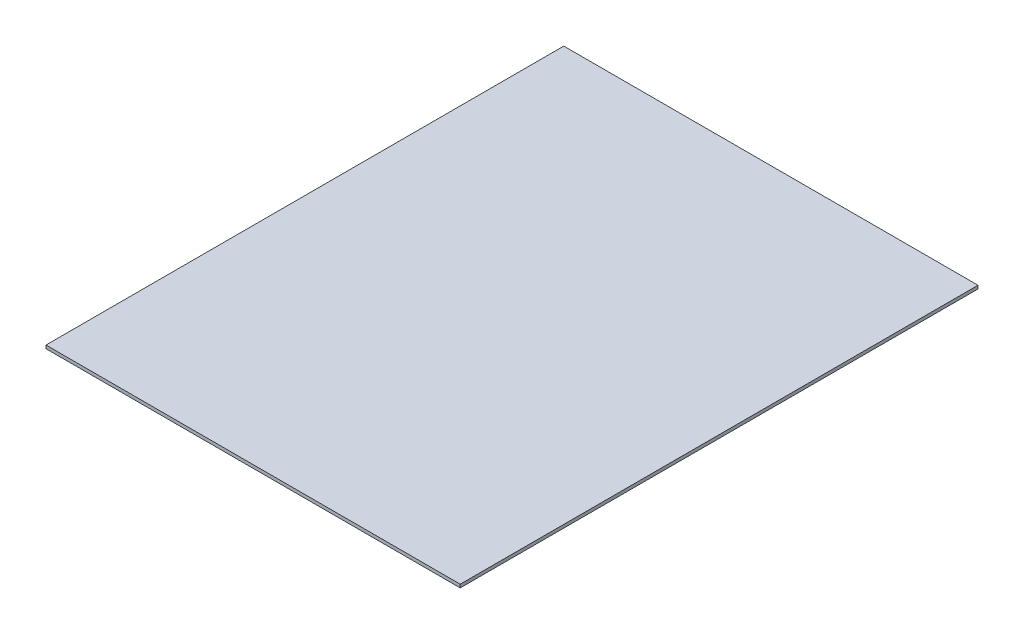
ISO-10303-21;
HEADER;
FILE_DESCRIPTION(('STEP AP214'),'2;1');
FILE_NAME('part.step','',(''),(''),'','','');
FILE_SCHEMA(('AUTOMOTIVE_DESIGN { 1 0 10303 214 1 1 1 1 }'));
ENDSEC;
DATA;
#1=APPLICATION_CONTEXT('core data for automotive mechanical design processes');
#2=APPLICATION_PROTOCOL_DEFINITION('international standard','automotive_design',2000,#1);
#3=PRODUCT_CONTEXT('',#1,'mechanical');
#4=PRODUCT('Part','Part','',(#3));
#5=PRODUCT_RELATED_PRODUCT_CATEGORY('part','',(#4));
#6=PRODUCT_DEFINITION_FORMATION('','',#4);
#7=PRODUCT_DEFINITION_CONTEXT('part definition',#1,'design');
#8=PRODUCT_DEFINITION('design','',#6,#7);
#9=PRODUCT_DEFINITION_SHAPE('','',#8);
#10=(LENGTH_UNIT() NAMED_UNIT(*) SI_UNIT(.MILLI.,.METRE.));
#11=(NAMED_UNIT(*) PLANE_ANGLE_UNIT() SI_UNIT($,.RADIAN.));
#12=(NAMED_UNIT(*) SI_UNIT($,.STERADIAN.) SOLID_ANGLE_UNIT());
#13=UNCERTAINTY_MEASURE_WITH_UNIT(LENGTH_MEASURE(1.E-05),#10,'distance_accuracy_value','');
#14=(GEOMETRIC_REPRESENTATION_CONTEXT(3) GLOBAL_UNCERTAINTY_ASSIGNED_CONTEXT((#13)) GLOBAL_UNIT_ASSIGNED_CONTEXT((#10,
#11,#12)) REPRESENTATION_CONTEXT('',''));
#15=CARTESIAN_POINT('',(0.,0.,0.));
#16=DIRECTION('',(0.,0.,1.));
#17=DIRECTION('',(1.,0.,0.));
#18=AXIS2_PLACEMENT_3D('',#15,#16,#17);
#19=CARTESIAN_POINT('',(0.,3.175,0.));
#20=DIRECTION('',(1.,0.,0.));
#21=DIRECTION('',(0.,0.,-1.));
#22=AXIS2_PLACEMENT_3D('',#19,#20,#21);
#23=PLANE('',#22);
#24=DIRECTION('',(0.,0.,1.));
#25=VECTOR('',#24,1.);
#26=CARTESIAN_POINT('',(0.,0.,0.));
#27=LINE('',#26,#25);
#28=CARTESIAN_POINT('',(0.,0.,-508.));
#29=VERTEX_POINT('',#28);
#30=CARTESIAN_POINT('',(0.,0.,0.));
#31=VERTEX_POINT('',#30);
#32=EDGE_CURVE('E96',#29,#31,#27,.T.);
#33=ORIENTED_EDGE('',*,*,#32,.T.);
#34=DIRECTION('',(0.,-1.,0.));
#35=VECTOR('',#34,1.);
#36=CARTESIAN_POINT('',(0.,3.175,0.));
#37=LINE('',#36,#35);
#38=CARTESIAN_POINT('',(0.,3.175,0.));
#39=VERTEX_POINT('',#38);
#40=EDGE_CURVE('E11',#39,#31,#37,.T.);
#41=ORIENTED_EDGE('',*,*,#40,.F.);
#42=DIRECTION('',(0.,0.,1.));
#43=VECTOR('',#42,1.);
#44=CARTESIAN_POINT('',(0.,3.175,0.));
#45=LINE('',#44,#43);
#46=CARTESIAN_POINT('',(0.,3.175,-508.));
#47=VERTEX_POINT('',#46);
#48=EDGE_CURVE('E84',#47,#39,#45,.T.);
#49=ORIENTED_EDGE('',*,*,#48,.F.);
#50=DIRECTION('',(0.,-1.,0.));
#51=VECTOR('',#50,1.);
#52=CARTESIAN_POINT('',(0.,3.175,-508.));
#53=LINE('',#52,#51);
#54=EDGE_CURVE('E92',#47,#29,#53,.T.);
#55=ORIENTED_EDGE('',*,*,#54,.T.);
#56=EDGE_LOOP('',(#33,#41,#49,#55));
#57=FACE_BOUND('',#56,.T.);
#58=ADVANCED_FACE('F33',(#57),#23,.F.);
#59=CARTESIAN_POINT('',(0.,3.175,0.));
#60=DIRECTION('',(0.,0.,-1.));
#61=DIRECTION('',(-1.,0.,0.));
#62=AXIS2_PLACEMENT_3D('',#59,#60,#61);
#63=PLANE('',#62);
#64=DIRECTION('',(1.,0.,0.));
#65=VECTOR('',#64,1.);
#66=CARTESIAN_POINT('',(0.,0.,0.));
#67=LINE('',#66,#65);
#68=CARTESIAN_POINT('',(406.4,0.,0.));
#69=VERTEX_POINT('',#68);
#70=EDGE_CURVE('E88',#31,#69,#67,.T.);
#71=ORIENTED_EDGE('',*,*,#70,.T.);
#72=DIRECTION('',(0.,-1.,0.));
#73=VECTOR('',#72,1.);
#74=CARTESIAN_POINT('',(406.4,3.175,0.));
#75=LINE('',#74,#73);
#76=CARTESIAN_POINT('',(406.4,3.175,0.));
#77=VERTEX_POINT('',#76);
#78=EDGE_CURVE('E41',#77,#69,#75,.T.);
#79=ORIENTED_EDGE('',*,*,#78,.F.);
#80=DIRECTION('',(1.,0.,0.));
#81=VECTOR('',#80,1.);
#82=CARTESIAN_POINT('',(0.,3.175,0.));
#83=LINE('',#82,#81);
#84=EDGE_CURVE('E79',#39,#77,#83,.T.);
#85=ORIENTED_EDGE('',*,*,#84,.F.);
#86=ORIENTED_EDGE('',*,*,#40,.T.);
#87=EDGE_LOOP('',(#71,#79,#85,#86));
#88=FACE_BOUND('',#87,.T.);
#89=ADVANCED_FACE('F87',(#88),#63,.F.);
#90=CARTESIAN_POINT('',(406.4,3.175,0.));
#91=DIRECTION('',(-1.,0.,0.));
#92=DIRECTION('',(0.,0.,1.));
#93=AXIS2_PLACEMENT_3D('',#90,#91,#92);
#94=PLANE('',#93);
#95=DIRECTION('',(0.,0.,-1.));
#96=VECTOR('',#95,1.);
#97=CARTESIAN_POINT('',(406.4,0.,0.));
#98=LINE('',#97,#96);
#99=CARTESIAN_POINT('',(406.4,0.,-508.));
#100=VERTEX_POINT('',#99);
#101=EDGE_CURVE('E66',#69,#100,#98,.T.);
#102=ORIENTED_EDGE('',*,*,#101,.T.);
#103=DIRECTION('',(0.,-1.,0.));
#104=VECTOR('',#103,1.);
#105=CARTESIAN_POINT('',(406.4,3.175,-508.));
#106=LINE('',#105,#104);
#107=CARTESIAN_POINT('',(406.4,3.175,-508.));
#108=VERTEX_POINT('',#107);
#109=EDGE_CURVE('E89',#108,#100,#106,.T.);
#110=ORIENTED_EDGE('',*,*,#109,.F.);
#111=DIRECTION('',(0.,0.,-1.));
#112=VECTOR('',#111,1.);
#113=CARTESIAN_POINT('',(406.4,3.175,0.));
#114=LINE('',#113,#112);
#115=EDGE_CURVE('E82',#77,#108,#114,.T.);
#116=ORIENTED_EDGE('',*,*,#115,.F.);
#117=ORIENTED_EDGE('',*,*,#78,.T.);
#118=EDGE_LOOP('',(#102,#110,#116,#117));
#119=FACE_BOUND('',#118,.T.);
#120=ADVANCED_FACE('F90',(#119),#94,.F.);
#121=CARTESIAN_POINT('',(0.,3.175,-508.));
#122=DIRECTION('',(0.,0.,1.));
#123=DIRECTION('',(1.,0.,0.));
#124=AXIS2_PLACEMENT_3D('',#121,#122,#123);
#125=PLANE('',#124);
#126=DIRECTION('',(-1.,0.,0.));
#127=VECTOR('',#126,1.);
#128=CARTESIAN_POINT('',(0.,0.,-508.));
#129=LINE('',#128,#127);
#130=EDGE_CURVE('E72',#100,#29,#129,.T.);
#131=ORIENTED_EDGE('',*,*,#130,.T.);
#132=ORIENTED_EDGE('',*,*,#54,.F.);
#133=DIRECTION('',(-1.,0.,0.));
#134=VECTOR('',#133,1.);
#135=CARTESIAN_POINT('',(0.,3.175,-508.));
#136=LINE('',#135,#134);
#137=EDGE_CURVE('E49',#108,#47,#136,.T.);
#138=ORIENTED_EDGE('',*,*,#137,.F.);
#139=ORIENTED_EDGE('',*,*,#109,.T.);
#140=EDGE_LOOP('',(#131,#132,#138,#139));
#141=FACE_BOUND('',#140,.T.);
#142=ADVANCED_FACE('F103',(#141),#125,.F.);
#143=CARTESIAN_POINT('',(0.,3.175,0.));
#144=DIRECTION('',(0.,-1.,0.));
#145=DIRECTION('',(0.,0.,-1.));
#146=AXIS2_PLACEMENT_3D('',#143,#144,#145);
#147=PLANE('',#146);
#148=ORIENTED_EDGE('',*,*,#48,.T.);
#149=ORIENTED_EDGE('',*,*,#84,.T.);
#150=ORIENTED_EDGE('',*,*,#115,.T.);
#151=ORIENTED_EDGE('',*,*,#137,.T.);
#152=EDGE_LOOP('',(#148,#149,#150,#151));
#153=FACE_BOUND('',#152,.T.);
#154=ADVANCED_FACE('F80',(#153),#147,.F.);
#155=CARTESIAN_POINT('',(0.,0.,0.));
#156=DIRECTION('',(0.,-1.,0.));
#157=DIRECTION('',(0.,0.,-1.));
#158=AXIS2_PLACEMENT_3D('',#155,#156,#157);
#159=PLANE('',#158);
#160=ORIENTED_EDGE('',*,*,#32,.F.);
#161=ORIENTED_EDGE('',*,*,#130,.F.);
#162=ORIENTED_EDGE('',*,*,#101,.F.);
#163=ORIENTED_EDGE('',*,*,#70,.F.);
#164=EDGE_LOOP('',(#160,#161,#162,#163));
#165=FACE_BOUND('',#164,.T.);
#166=ADVANCED_FACE('F106',(#165),#159,.T.);
#167=CLOSED_SHELL('',(#58,#89,#120,#142,#154,#166));
#168=MANIFOLD_SOLID_BREP('B2',#167);
#169=ADVANCED_BREP_SHAPE_REPRESENTATION('',(#18,#168),#14);
#170=SHAPE_DEFINITION_REPRESENTATION(#9,#169);
ENDSEC;
END-ISO-10303-21;
